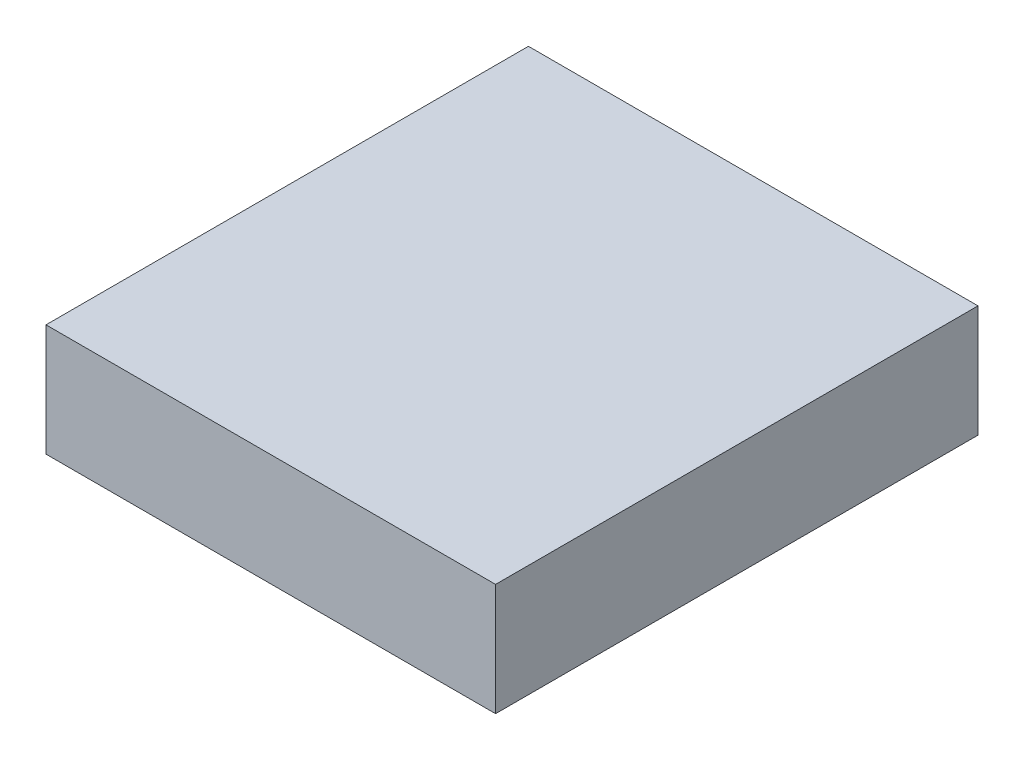
ISO-10303-21;
HEADER;
FILE_DESCRIPTION(('STEP AP214'),'2;1');
FILE_NAME('part.step','',(''),(''),'','','');
FILE_SCHEMA(('AUTOMOTIVE_DESIGN { 1 0 10303 214 1 1 1 1 }'));
ENDSEC;
DATA;
#1=APPLICATION_CONTEXT('core data for automotive mechanical design processes');
#2=APPLICATION_PROTOCOL_DEFINITION('international standard','automotive_design',2000,#1);
#3=PRODUCT_CONTEXT('',#1,'mechanical');
#4=PRODUCT('Part','Part','',(#3));
#5=PRODUCT_RELATED_PRODUCT_CATEGORY('part','',(#4));
#6=PRODUCT_DEFINITION_FORMATION('','',#4);
#7=PRODUCT_DEFINITION_CONTEXT('part definition',#1,'design');
#8=PRODUCT_DEFINITION('design','',#6,#7);
#9=PRODUCT_DEFINITION_SHAPE('','',#8);
#10=(LENGTH_UNIT() NAMED_UNIT(*) SI_UNIT(.MILLI.,.METRE.));
#11=(NAMED_UNIT(*) PLANE_ANGLE_UNIT() SI_UNIT($,.RADIAN.));
#12=(NAMED_UNIT(*) SI_UNIT($,.STERADIAN.) SOLID_ANGLE_UNIT());
#13=UNCERTAINTY_MEASURE_WITH_UNIT(LENGTH_MEASURE(1.E-05),#10,'distance_accuracy_value','');
#14=(GEOMETRIC_REPRESENTATION_CONTEXT(3) GLOBAL_UNCERTAINTY_ASSIGNED_CONTEXT((#13)) GLOBAL_UNIT_ASSIGNED_CONTEXT((#10,
#11,#12)) REPRESENTATION_CONTEXT('',''));
#15=CARTESIAN_POINT('',(0.,0.,0.));
#16=DIRECTION('',(0.,0.,1.));
#17=DIRECTION('',(1.,0.,0.));
#18=AXIS2_PLACEMENT_3D('',#15,#16,#17);
#19=CARTESIAN_POINT('',(0.,0.,100.));
#20=DIRECTION('',(1.,0.,0.));
#21=DIRECTION('',(0.,0.,-1.));
#22=AXIS2_PLACEMENT_3D('',#19,#20,#21);
#23=PLANE('',#22);
#24=DIRECTION('',(0.,-1.,0.));
#25=VECTOR('',#24,1.);
#26=CARTESIAN_POINT('',(0.,0.,0.));
#27=LINE('',#26,#25);
#28=CARTESIAN_POINT('',(0.,23.2159811655492,0.));
#29=VERTEX_POINT('',#28);
#30=CARTESIAN_POINT('',(0.,0.,0.));
#31=VERTEX_POINT('',#30);
#32=EDGE_CURVE('E96',#29,#31,#27,.T.);
#33=ORIENTED_EDGE('',*,*,#32,.T.);
#34=DIRECTION('',(0.,0.,-1.));
#35=VECTOR('',#34,1.);
#36=CARTESIAN_POINT('',(0.,0.,100.));
#37=LINE('',#36,#35);
#38=CARTESIAN_POINT('',(0.,0.,100.));
#39=VERTEX_POINT('',#38);
#40=EDGE_CURVE('E11',#39,#31,#37,.T.);
#41=ORIENTED_EDGE('',*,*,#40,.F.);
#42=DIRECTION('',(0.,-1.,0.));
#43=VECTOR('',#42,1.);
#44=CARTESIAN_POINT('',(0.,0.,100.));
#45=LINE('',#44,#43);
#46=CARTESIAN_POINT('',(0.,23.2159811655492,100.));
#47=VERTEX_POINT('',#46);
#48=EDGE_CURVE('E84',#47,#39,#45,.T.);
#49=ORIENTED_EDGE('',*,*,#48,.F.);
#50=DIRECTION('',(0.,0.,-1.));
#51=VECTOR('',#50,1.);
#52=CARTESIAN_POINT('',(0.,23.2159811655492,100.));
#53=LINE('',#52,#51);
#54=EDGE_CURVE('E92',#47,#29,#53,.T.);
#55=ORIENTED_EDGE('',*,*,#54,.T.);
#56=EDGE_LOOP('',(#33,#41,#49,#55));
#57=FACE_BOUND('',#56,.T.);
#58=ADVANCED_FACE('F33',(#57),#23,.F.);
#59=CARTESIAN_POINT('',(0.,0.,100.));
#60=DIRECTION('',(0.,1.,0.));
#61=DIRECTION('',(0.,0.,1.));
#62=AXIS2_PLACEMENT_3D('',#59,#60,#61);
#63=PLANE('',#62);
#64=DIRECTION('',(1.,0.,0.));
#65=VECTOR('',#64,1.);
#66=CARTESIAN_POINT('',(0.,0.,0.));
#67=LINE('',#66,#65);
#68=CARTESIAN_POINT('',(93.1875328090541,0.,0.));
#69=VERTEX_POINT('',#68);
#70=EDGE_CURVE('E88',#31,#69,#67,.T.);
#71=ORIENTED_EDGE('',*,*,#70,.T.);
#72=DIRECTION('',(0.,0.,-1.));
#73=VECTOR('',#72,1.);
#74=CARTESIAN_POINT('',(93.1875328090541,0.,100.));
#75=LINE('',#74,#73);
#76=CARTESIAN_POINT('',(93.1875328090541,0.,100.));
#77=VERTEX_POINT('',#76);
#78=EDGE_CURVE('E41',#77,#69,#75,.T.);
#79=ORIENTED_EDGE('',*,*,#78,.F.);
#80=DIRECTION('',(1.,0.,0.));
#81=VECTOR('',#80,1.);
#82=CARTESIAN_POINT('',(0.,0.,100.));
#83=LINE('',#82,#81);
#84=EDGE_CURVE('E79',#39,#77,#83,.T.);
#85=ORIENTED_EDGE('',*,*,#84,.F.);
#86=ORIENTED_EDGE('',*,*,#40,.T.);
#87=EDGE_LOOP('',(#71,#79,#85,#86));
#88=FACE_BOUND('',#87,.T.);
#89=ADVANCED_FACE('F87',(#88),#63,.F.);
#90=CARTESIAN_POINT('',(93.1875328090541,0.,100.));
#91=DIRECTION('',(-1.,0.,0.));
#92=DIRECTION('',(0.,0.,1.));
#93=AXIS2_PLACEMENT_3D('',#90,#91,#92);
#94=PLANE('',#93);
#95=DIRECTION('',(0.,1.,0.));
#96=VECTOR('',#95,1.);
#97=CARTESIAN_POINT('',(93.1875328090541,0.,0.));
#98=LINE('',#97,#96);
#99=CARTESIAN_POINT('',(93.1875328090541,23.2159811655492,0.));
#100=VERTEX_POINT('',#99);
#101=EDGE_CURVE('E66',#69,#100,#98,.T.);
#102=ORIENTED_EDGE('',*,*,#101,.T.);
#103=DIRECTION('',(0.,0.,-1.));
#104=VECTOR('',#103,1.);
#105=CARTESIAN_POINT('',(93.1875328090541,23.2159811655492,100.));
#106=LINE('',#105,#104);
#107=CARTESIAN_POINT('',(93.1875328090541,23.2159811655492,100.));
#108=VERTEX_POINT('',#107);
#109=EDGE_CURVE('E89',#108,#100,#106,.T.);
#110=ORIENTED_EDGE('',*,*,#109,.F.);
#111=DIRECTION('',(0.,1.,0.));
#112=VECTOR('',#111,1.);
#113=CARTESIAN_POINT('',(93.1875328090541,0.,100.));
#114=LINE('',#113,#112);
#115=EDGE_CURVE('E82',#77,#108,#114,.T.);
#116=ORIENTED_EDGE('',*,*,#115,.F.);
#117=ORIENTED_EDGE('',*,*,#78,.T.);
#118=EDGE_LOOP('',(#102,#110,#116,#117));
#119=FACE_BOUND('',#118,.T.);
#120=ADVANCED_FACE('F90',(#119),#94,.F.);
#121=CARTESIAN_POINT('',(0.,23.2159811655492,100.));
#122=DIRECTION('',(0.,-1.,0.));
#123=DIRECTION('',(0.,0.,-1.));
#124=AXIS2_PLACEMENT_3D('',#121,#122,#123);
#125=PLANE('',#124);
#126=DIRECTION('',(-1.,0.,0.));
#127=VECTOR('',#126,1.);
#128=CARTESIAN_POINT('',(0.,23.2159811655492,0.));
#129=LINE('',#128,#127);
#130=EDGE_CURVE('E72',#100,#29,#129,.T.);
#131=ORIENTED_EDGE('',*,*,#130,.T.);
#132=ORIENTED_EDGE('',*,*,#54,.F.);
#133=DIRECTION('',(-1.,0.,0.));
#134=VECTOR('',#133,1.);
#135=CARTESIAN_POINT('',(0.,23.2159811655492,100.));
#136=LINE('',#135,#134);
#137=EDGE_CURVE('E49',#108,#47,#136,.T.);
#138=ORIENTED_EDGE('',*,*,#137,.F.);
#139=ORIENTED_EDGE('',*,*,#109,.T.);
#140=EDGE_LOOP('',(#131,#132,#138,#139));
#141=FACE_BOUND('',#140,.T.);
#142=ADVANCED_FACE('F103',(#141),#125,.F.);
#143=CARTESIAN_POINT('',(0.,0.,100.));
#144=DIRECTION('',(0.,0.,-1.));
#145=DIRECTION('',(-1.,0.,0.));
#146=AXIS2_PLACEMENT_3D('',#143,#144,#145);
#147=PLANE('',#146);
#148=ORIENTED_EDGE('',*,*,#48,.T.);
#149=ORIENTED_EDGE('',*,*,#84,.T.);
#150=ORIENTED_EDGE('',*,*,#115,.T.);
#151=ORIENTED_EDGE('',*,*,#137,.T.);
#152=EDGE_LOOP('',(#148,#149,#150,#151));
#153=FACE_BOUND('',#152,.T.);
#154=ADVANCED_FACE('F80',(#153),#147,.F.);
#155=CARTESIAN_POINT('',(0.,0.,0.));
#156=DIRECTION('',(0.,0.,-1.));
#157=DIRECTION('',(-1.,0.,0.));
#158=AXIS2_PLACEMENT_3D('',#155,#156,#157);
#159=PLANE('',#158);
#160=ORIENTED_EDGE('',*,*,#32,.F.);
#161=ORIENTED_EDGE('',*,*,#130,.F.);
#162=ORIENTED_EDGE('',*,*,#101,.F.);
#163=ORIENTED_EDGE('',*,*,#70,.F.);
#164=EDGE_LOOP('',(#160,#161,#162,#163));
#165=FACE_BOUND('',#164,.T.);
#166=ADVANCED_FACE('F106',(#165),#159,.T.);
#167=CLOSED_SHELL('',(#58,#89,#120,#142,#154,#166));
#168=MANIFOLD_SOLID_BREP('B2',#167);
#169=ADVANCED_BREP_SHAPE_REPRESENTATION('',(#18,#168),#14);
#170=SHAPE_DEFINITION_REPRESENTATION(#9,#169);
ENDSEC;
END-ISO-10303-21;
